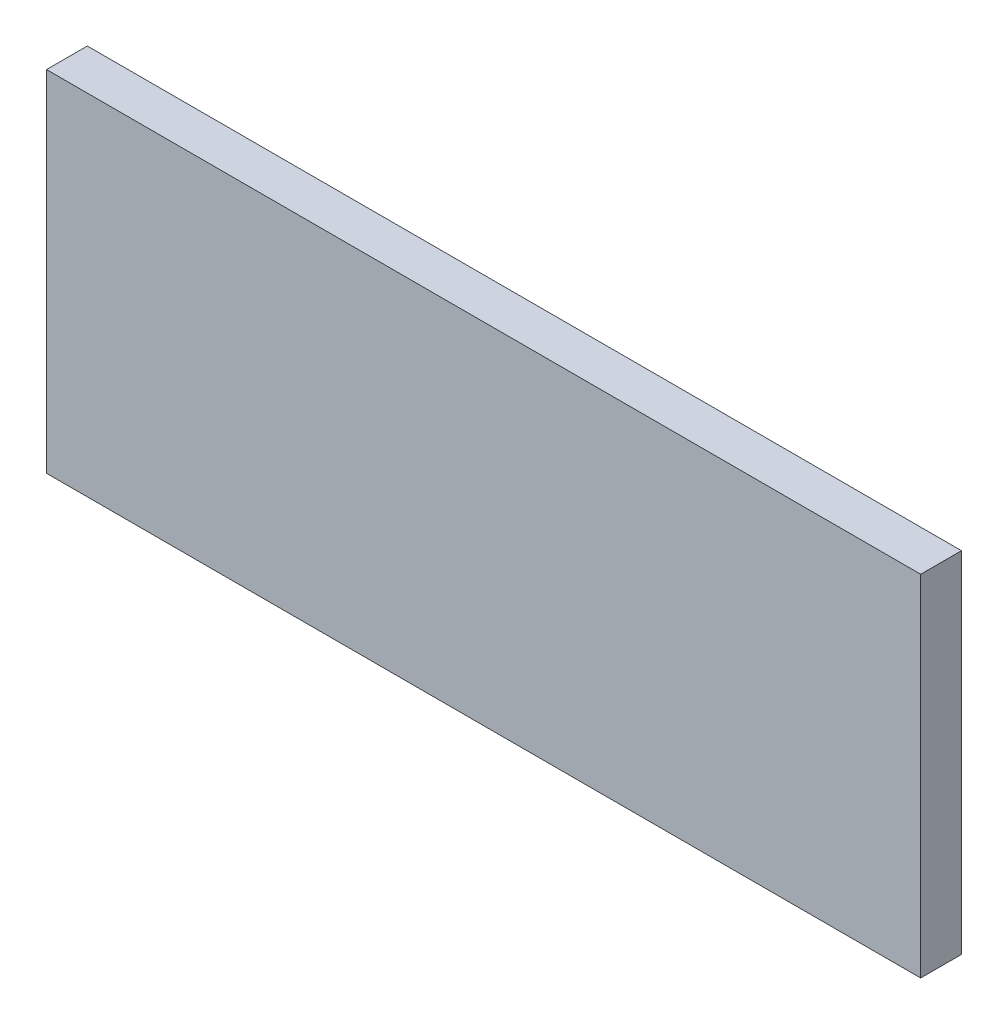
ISO-10303-21;
HEADER;
FILE_DESCRIPTION(('STEP AP214'),'2;1');
FILE_NAME('part.step','',(''),(''),'','','');
FILE_SCHEMA(('AUTOMOTIVE_DESIGN { 1 0 10303 214 1 1 1 1 }'));
ENDSEC;
DATA;
#1=APPLICATION_CONTEXT('core data for automotive mechanical design processes');
#2=APPLICATION_PROTOCOL_DEFINITION('international standard','automotive_design',2000,#1);
#3=PRODUCT_CONTEXT('',#1,'mechanical');
#4=PRODUCT('Part','Part','',(#3));
#5=PRODUCT_RELATED_PRODUCT_CATEGORY('part','',(#4));
#6=PRODUCT_DEFINITION_FORMATION('','',#4);
#7=PRODUCT_DEFINITION_CONTEXT('part definition',#1,'design');
#8=PRODUCT_DEFINITION('design','',#6,#7);
#9=PRODUCT_DEFINITION_SHAPE('','',#8);
#10=(LENGTH_UNIT() NAMED_UNIT(*) SI_UNIT(.MILLI.,.METRE.));
#11=(NAMED_UNIT(*) PLANE_ANGLE_UNIT() SI_UNIT($,.RADIAN.));
#12=(NAMED_UNIT(*) SI_UNIT($,.STERADIAN.) SOLID_ANGLE_UNIT());
#13=UNCERTAINTY_MEASURE_WITH_UNIT(LENGTH_MEASURE(1.E-05),#10,'distance_accuracy_value','');
#14=(GEOMETRIC_REPRESENTATION_CONTEXT(3) GLOBAL_UNCERTAINTY_ASSIGNED_CONTEXT((#13)) GLOBAL_UNIT_ASSIGNED_CONTEXT((#10,
#11,#12)) REPRESENTATION_CONTEXT('',''));
#15=CARTESIAN_POINT('',(0.,0.,0.));
#16=DIRECTION('',(0.,0.,1.));
#17=DIRECTION('',(1.,0.,0.));
#18=AXIS2_PLACEMENT_3D('',#15,#16,#17);
#19=CARTESIAN_POINT('',(148.55,-116.263,1.635));
#20=DIRECTION('',(0.,0.,-1.));
#21=DIRECTION('',(0.,-1.,0.));
#22=AXIS2_PLACEMENT_3D('',#19,#20,#21);
#23=PLANE('',#22);
#24=DIRECTION('',(0.,-1.,0.));
#25=VECTOR('',#24,1.);
#26=CARTESIAN_POINT('',(148.925,-116.113,1.635));
#27=LINE('',#26,#25);
#28=CARTESIAN_POINT('',(148.925,-116.113,1.635));
#29=VERTEX_POINT('',#28);
#30=CARTESIAN_POINT('',(148.925,-116.413,1.635));
#31=VERTEX_POINT('',#30);
#32=EDGE_CURVE('E26',#29,#31,#27,.T.);
#33=ORIENTED_EDGE('',*,*,#32,.F.);
#34=DIRECTION('',(1.,0.,0.));
#35=VECTOR('',#34,1.);
#36=CARTESIAN_POINT('',(148.175,-116.113,1.635));
#37=LINE('',#36,#35);
#38=CARTESIAN_POINT('',(148.175,-116.113,1.635));
#39=VERTEX_POINT('',#38);
#40=EDGE_CURVE('E102',#39,#29,#37,.T.);
#41=ORIENTED_EDGE('',*,*,#40,.F.);
#42=DIRECTION('',(0.,1.,0.));
#43=VECTOR('',#42,1.);
#44=CARTESIAN_POINT('',(148.175,-116.413,1.635));
#45=LINE('',#44,#43);
#46=CARTESIAN_POINT('',(148.175,-116.413,1.635));
#47=VERTEX_POINT('',#46);
#48=EDGE_CURVE('E84',#47,#39,#45,.T.);
#49=ORIENTED_EDGE('',*,*,#48,.F.);
#50=DIRECTION('',(-1.,0.,0.));
#51=VECTOR('',#50,1.);
#52=CARTESIAN_POINT('',(148.925,-116.413,1.635));
#53=LINE('',#52,#51);
#54=EDGE_CURVE('E88',#31,#47,#53,.T.);
#55=ORIENTED_EDGE('',*,*,#54,.F.);
#56=EDGE_LOOP('',(#33,#41,#49,#55));
#57=FACE_BOUND('',#56,.T.);
#58=ADVANCED_FACE('F17',(#57),#23,.F.);
#59=CARTESIAN_POINT('',(148.55,-116.263,1.6));
#60=DIRECTION('',(0.,0.,-1.));
#61=DIRECTION('',(0.,-1.,0.));
#62=AXIS2_PLACEMENT_3D('',#59,#60,#61);
#63=PLANE('',#62);
#64=DIRECTION('',(-1.,0.,0.));
#65=VECTOR('',#64,1.);
#66=CARTESIAN_POINT('',(148.925,-116.413,1.6));
#67=LINE('',#66,#65);
#68=CARTESIAN_POINT('',(148.925,-116.413,1.6));
#69=VERTEX_POINT('',#68);
#70=CARTESIAN_POINT('',(148.175,-116.413,1.6));
#71=VERTEX_POINT('',#70);
#72=EDGE_CURVE('E73',#69,#71,#67,.T.);
#73=ORIENTED_EDGE('',*,*,#72,.T.);
#74=DIRECTION('',(0.,1.,0.));
#75=VECTOR('',#74,1.);
#76=CARTESIAN_POINT('',(148.175,-116.413,1.6));
#77=LINE('',#76,#75);
#78=CARTESIAN_POINT('',(148.175,-116.113,1.6));
#79=VERTEX_POINT('',#78);
#80=EDGE_CURVE('E100',#71,#79,#77,.T.);
#81=ORIENTED_EDGE('',*,*,#80,.T.);
#82=DIRECTION('',(1.,0.,0.));
#83=VECTOR('',#82,1.);
#84=CARTESIAN_POINT('',(148.175,-116.113,1.6));
#85=LINE('',#84,#83);
#86=CARTESIAN_POINT('',(148.925,-116.113,1.6));
#87=VERTEX_POINT('',#86);
#88=EDGE_CURVE('E20',#79,#87,#85,.T.);
#89=ORIENTED_EDGE('',*,*,#88,.T.);
#90=DIRECTION('',(0.,-1.,0.));
#91=VECTOR('',#90,1.);
#92=CARTESIAN_POINT('',(148.925,-116.113,1.6));
#93=LINE('',#92,#91);
#94=EDGE_CURVE('E11',#87,#69,#93,.T.);
#95=ORIENTED_EDGE('',*,*,#94,.T.);
#96=EDGE_LOOP('',(#73,#81,#89,#95));
#97=FACE_BOUND('',#96,.T.);
#98=ADVANCED_FACE('F71',(#97),#63,.T.);
#99=CARTESIAN_POINT('',(148.925,-116.113,1.6));
#100=DIRECTION('',(1.,0.,0.));
#101=DIRECTION('',(0.,1.,0.));
#102=AXIS2_PLACEMENT_3D('',#99,#100,#101);
#103=PLANE('',#102);
#104=DIRECTION('',(0.,0.,1.));
#105=VECTOR('',#104,1.);
#106=CARTESIAN_POINT('',(148.925,-116.113,1.6));
#107=LINE('',#106,#105);
#108=EDGE_CURVE('E113',#87,#29,#107,.T.);
#109=ORIENTED_EDGE('',*,*,#108,.T.);
#110=ORIENTED_EDGE('',*,*,#32,.T.);
#111=DIRECTION('',(0.,0.,1.));
#112=VECTOR('',#111,1.);
#113=CARTESIAN_POINT('',(148.925,-116.413,1.6));
#114=LINE('',#113,#112);
#115=EDGE_CURVE('E80',#69,#31,#114,.T.);
#116=ORIENTED_EDGE('',*,*,#115,.F.);
#117=ORIENTED_EDGE('',*,*,#94,.F.);
#118=EDGE_LOOP('',(#109,#110,#116,#117));
#119=FACE_BOUND('',#118,.T.);
#120=ADVANCED_FACE('F86',(#119),#103,.T.);
#121=CARTESIAN_POINT('',(148.175,-116.113,1.6));
#122=DIRECTION('',(0.,1.,0.));
#123=DIRECTION('',(1.,0.,0.));
#124=AXIS2_PLACEMENT_3D('',#121,#122,#123);
#125=PLANE('',#124);
#126=DIRECTION('',(0.,0.,1.));
#127=VECTOR('',#126,1.);
#128=CARTESIAN_POINT('',(148.175,-116.113,1.6));
#129=LINE('',#128,#127);
#130=EDGE_CURVE('E103',#79,#39,#129,.T.);
#131=ORIENTED_EDGE('',*,*,#130,.T.);
#132=ORIENTED_EDGE('',*,*,#40,.T.);
#133=ORIENTED_EDGE('',*,*,#108,.F.);
#134=ORIENTED_EDGE('',*,*,#88,.F.);
#135=EDGE_LOOP('',(#131,#132,#133,#134));
#136=FACE_BOUND('',#135,.T.);
#137=ADVANCED_FACE('F147',(#136),#125,.T.);
#138=CARTESIAN_POINT('',(148.175,-116.413,1.6));
#139=DIRECTION('',(-1.,0.,0.));
#140=DIRECTION('',(0.,0.,1.));
#141=AXIS2_PLACEMENT_3D('',#138,#139,#140);
#142=PLANE('',#141);
#143=DIRECTION('',(0.,0.,1.));
#144=VECTOR('',#143,1.);
#145=CARTESIAN_POINT('',(148.175,-116.413,1.6));
#146=LINE('',#145,#144);
#147=EDGE_CURVE('E82',#71,#47,#146,.T.);
#148=ORIENTED_EDGE('',*,*,#147,.T.);
#149=ORIENTED_EDGE('',*,*,#48,.T.);
#150=ORIENTED_EDGE('',*,*,#130,.F.);
#151=ORIENTED_EDGE('',*,*,#80,.F.);
#152=EDGE_LOOP('',(#148,#149,#150,#151));
#153=FACE_BOUND('',#152,.T.);
#154=ADVANCED_FACE('F137',(#153),#142,.T.);
#155=CARTESIAN_POINT('',(148.925,-116.413,1.6));
#156=DIRECTION('',(0.,-1.,0.));
#157=DIRECTION('',(0.,0.,-1.));
#158=AXIS2_PLACEMENT_3D('',#155,#156,#157);
#159=PLANE('',#158);
#160=ORIENTED_EDGE('',*,*,#115,.T.);
#161=ORIENTED_EDGE('',*,*,#54,.T.);
#162=ORIENTED_EDGE('',*,*,#147,.F.);
#163=ORIENTED_EDGE('',*,*,#72,.F.);
#164=EDGE_LOOP('',(#160,#161,#162,#163));
#165=FACE_BOUND('',#164,.T.);
#166=ADVANCED_FACE('F78',(#165),#159,.T.);
#167=CLOSED_SHELL('',(#58,#98,#120,#137,#154,#166));
#168=MANIFOLD_SOLID_BREP('B1',#167);
#169=ADVANCED_BREP_SHAPE_REPRESENTATION('',(#18,#168),#14);
#170=SHAPE_DEFINITION_REPRESENTATION(#9,#169);
ENDSEC;
END-ISO-10303-21;
